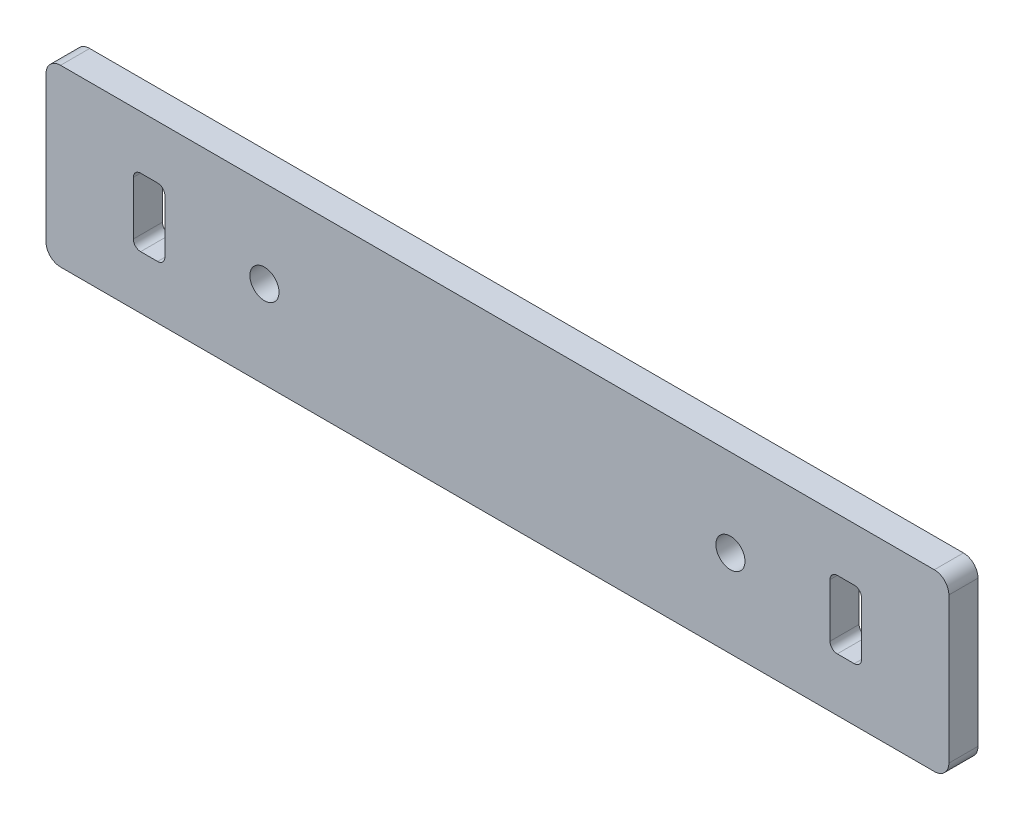
ISO-10303-21;
HEADER;
FILE_DESCRIPTION(('STEP AP214'),'2;1');
FILE_NAME('part.step','',(''),(''),'','','');
FILE_SCHEMA(('AUTOMOTIVE_DESIGN { 1 0 10303 214 1 1 1 1 }'));
ENDSEC;
DATA;
#1=APPLICATION_CONTEXT('core data for automotive mechanical design processes');
#2=APPLICATION_PROTOCOL_DEFINITION('international standard','automotive_design',2000,#1);
#3=PRODUCT_CONTEXT('',#1,'mechanical');
#4=PRODUCT('Part','Part','',(#3));
#5=PRODUCT_RELATED_PRODUCT_CATEGORY('part','',(#4));
#6=PRODUCT_DEFINITION_FORMATION('','',#4);
#7=PRODUCT_DEFINITION_CONTEXT('part definition',#1,'design');
#8=PRODUCT_DEFINITION('design','',#6,#7);
#9=PRODUCT_DEFINITION_SHAPE('','',#8);
#10=(LENGTH_UNIT() NAMED_UNIT(*) SI_UNIT(.MILLI.,.METRE.));
#11=(NAMED_UNIT(*) PLANE_ANGLE_UNIT() SI_UNIT($,.RADIAN.));
#12=(NAMED_UNIT(*) SI_UNIT($,.STERADIAN.) SOLID_ANGLE_UNIT());
#13=UNCERTAINTY_MEASURE_WITH_UNIT(LENGTH_MEASURE(1.E-05),#10,'distance_accuracy_value','');
#14=(GEOMETRIC_REPRESENTATION_CONTEXT(3) GLOBAL_UNCERTAINTY_ASSIGNED_CONTEXT((#13)) GLOBAL_UNIT_ASSIGNED_CONTEXT((#10,
#11,#12)) REPRESENTATION_CONTEXT('',''));
#15=CARTESIAN_POINT('',(0.,0.,0.));
#16=DIRECTION('',(0.,0.,1.));
#17=DIRECTION('',(1.,0.,0.));
#18=AXIS2_PLACEMENT_3D('',#15,#16,#17);
#19=CARTESIAN_POINT('',(-1478.2269349458,335.4081797565,3.));
#20=DIRECTION('',(0.,0.,1.));
#21=DIRECTION('',(1.,0.,0.));
#22=AXIS2_PLACEMENT_3D('',#19,#20,#21);
#23=PLANE('',#22);
#24=DIRECTION('',(0.,-1.,0.));
#25=VECTOR('',#24,1.);
#26=CARTESIAN_POINT('',(-1470.7319349458,325.1581797565,3.));
#27=LINE('',#26,#25);
#28=CARTESIAN_POINT('',(-1470.7319349458,330.6581797565,3.));
#29=VERTEX_POINT('',#28);
#30=CARTESIAN_POINT('',(-1470.7319349458,325.1581797565,3.));
#31=VERTEX_POINT('',#30);
#32=EDGE_CURVE('E261',#29,#31,#27,.T.);
#33=ORIENTED_EDGE('',*,*,#32,.F.);
#34=CARTESIAN_POINT('',(-1469.9819349458,330.6581797565,3.));
#35=DIRECTION('',(0.,0.,1.));
#36=DIRECTION('',(1.,0.,0.));
#37=AXIS2_PLACEMENT_3D('',#34,#35,#36);
#38=CIRCLE('',#37,0.750000000000028);
#39=CARTESIAN_POINT('',(-1469.9819349458,331.4081797565,3.));
#40=VERTEX_POINT('',#39);
#41=EDGE_CURVE('E259',#40,#29,#38,.T.);
#42=ORIENTED_EDGE('',*,*,#41,.F.);
#43=DIRECTION('',(-1.,0.,0.));
#44=VECTOR('',#43,1.);
#45=CARTESIAN_POINT('',(-1469.9819349458,331.4081797565,3.));
#46=LINE('',#45,#44);
#47=CARTESIAN_POINT('',(-1468.2319349458,331.4081797565,3.));
#48=VERTEX_POINT('',#47);
#49=EDGE_CURVE('E275',#48,#40,#46,.T.);
#50=ORIENTED_EDGE('',*,*,#49,.F.);
#51=CARTESIAN_POINT('',(-1468.2319349458,330.6581797565,3.));
#52=DIRECTION('',(0.,0.,1.));
#53=DIRECTION('',(1.,0.,0.));
#54=AXIS2_PLACEMENT_3D('',#51,#52,#53);
#55=CIRCLE('',#54,0.750000000000028);
#56=CARTESIAN_POINT('',(-1467.4819349458,330.6581797565,3.));
#57=VERTEX_POINT('',#56);
#58=EDGE_CURVE('E272',#57,#48,#55,.T.);
#59=ORIENTED_EDGE('',*,*,#58,.F.);
#60=DIRECTION('',(0.,1.,0.));
#61=VECTOR('',#60,1.);
#62=CARTESIAN_POINT('',(-1467.4819349458,325.1581797565,3.));
#63=LINE('',#62,#61);
#64=CARTESIAN_POINT('',(-1467.4819349458,325.1581797565,3.));
#65=VERTEX_POINT('',#64);
#66=EDGE_CURVE('E270',#65,#57,#63,.T.);
#67=ORIENTED_EDGE('',*,*,#66,.F.);
#68=CARTESIAN_POINT('',(-1468.2319349458,325.1581797565,3.));
#69=DIRECTION('',(0.,0.,1.));
#70=DIRECTION('',(1.,0.,0.));
#71=AXIS2_PLACEMENT_3D('',#68,#69,#70);
#72=CIRCLE('',#71,0.750000000000001);
#73=CARTESIAN_POINT('',(-1468.2319349458,324.4081797565,3.));
#74=VERTEX_POINT('',#73);
#75=EDGE_CURVE('E268',#74,#65,#72,.T.);
#76=ORIENTED_EDGE('',*,*,#75,.F.);
#77=DIRECTION('',(1.,0.,0.));
#78=VECTOR('',#77,1.);
#79=CARTESIAN_POINT('',(-1468.2319349458,324.4081797565,3.));
#80=LINE('',#79,#78);
#81=CARTESIAN_POINT('',(-1469.9819349458,324.4081797565,3.));
#82=VERTEX_POINT('',#81);
#83=EDGE_CURVE('E266',#82,#74,#80,.T.);
#84=ORIENTED_EDGE('',*,*,#83,.F.);
#85=CARTESIAN_POINT('',(-1469.9819349458,325.1581797565,3.));
#86=DIRECTION('',(0.,0.,1.));
#87=DIRECTION('',(1.,0.,0.));
#88=AXIS2_PLACEMENT_3D('',#85,#86,#87);
#89=CIRCLE('',#88,0.750000000000001);
#90=EDGE_CURVE('E264',#31,#82,#89,.T.);
#91=ORIENTED_EDGE('',*,*,#90,.F.);
#92=EDGE_LOOP('',(#33,#42,#50,#59,#67,#76,#84,#91));
#93=FACE_BOUND('',#92,.T.);
#94=CARTESIAN_POINT('',(-1457.2269349458,327.9081797565,3.));
#95=DIRECTION('',(0.,0.,1.));
#96=DIRECTION('',(1.,0.,0.));
#97=AXIS2_PLACEMENT_3D('',#94,#95,#96);
#98=CIRCLE('',#97,1.50000000000006);
#99=CARTESIAN_POINT('',(-1455.7269349458,327.9081797565,3.));
#100=VERTEX_POINT('',#99);
#101=EDGE_CURVE('E324',#100,#100,#98,.T.);
#102=ORIENTED_EDGE('',*,*,#101,.F.);
#103=EDGE_LOOP('',(#102));
#104=FACE_BOUND('',#103,.T.);
#105=CARTESIAN_POINT('',(-1478.2269349458,335.4081797565,3.));
#106=DIRECTION('',(0.,0.,1.));
#107=DIRECTION('',(1.,0.,0.));
#108=AXIS2_PLACEMENT_3D('',#105,#106,#107);
#109=CIRCLE('',#108,1.50000000000003);
#110=CARTESIAN_POINT('',(-1478.2269349458,336.9081797565,3.));
#111=VERTEX_POINT('',#110);
#112=CARTESIAN_POINT('',(-1479.7269349458,335.4081797565,3.));
#113=VERTEX_POINT('',#112);
#114=EDGE_CURVE('E330',#111,#113,#109,.T.);
#115=ORIENTED_EDGE('',*,*,#114,.T.);
#116=DIRECTION('',(0.,-1.,0.));
#117=VECTOR('',#116,1.);
#118=CARTESIAN_POINT('',(-1479.7269349458,320.4081797565,3.));
#119=LINE('',#118,#117);
#120=CARTESIAN_POINT('',(-1479.7269349458,320.4081797565,3.));
#121=VERTEX_POINT('',#120);
#122=EDGE_CURVE('E333',#113,#121,#119,.T.);
#123=ORIENTED_EDGE('',*,*,#122,.T.);
#124=CARTESIAN_POINT('',(-1478.2269349458,320.4081797565,3.));
#125=DIRECTION('',(0.,0.,1.));
#126=DIRECTION('',(1.,0.,0.));
#127=AXIS2_PLACEMENT_3D('',#124,#125,#126);
#128=CIRCLE('',#127,1.50000000000003);
#129=CARTESIAN_POINT('',(-1478.2269349458,318.9081797565,3.));
#130=VERTEX_POINT('',#129);
#131=EDGE_CURVE('E336',#121,#130,#128,.T.);
#132=ORIENTED_EDGE('',*,*,#131,.T.);
#133=DIRECTION('',(1.,0.,0.));
#134=VECTOR('',#133,1.);
#135=CARTESIAN_POINT('',(-1478.2269349458,318.9081797565,3.));
#136=LINE('',#135,#134);
#137=CARTESIAN_POINT('',(-1388.2269349458,318.9081797565,3.));
#138=VERTEX_POINT('',#137);
#139=EDGE_CURVE('E338',#130,#138,#136,.T.);
#140=ORIENTED_EDGE('',*,*,#139,.T.);
#141=CARTESIAN_POINT('',(-1388.2269349458,320.4081797565,3.));
#142=DIRECTION('',(0.,0.,1.));
#143=DIRECTION('',(1.,0.,0.));
#144=AXIS2_PLACEMENT_3D('',#141,#142,#143);
#145=CIRCLE('',#144,1.50000000000003);
#146=CARTESIAN_POINT('',(-1386.7269349458,320.4081797565,3.));
#147=VERTEX_POINT('',#146);
#148=EDGE_CURVE('E340',#138,#147,#145,.T.);
#149=ORIENTED_EDGE('',*,*,#148,.T.);
#150=DIRECTION('',(0.,1.,0.));
#151=VECTOR('',#150,1.);
#152=CARTESIAN_POINT('',(-1386.7269349458,320.4081797565,3.));
#153=LINE('',#152,#151);
#154=CARTESIAN_POINT('',(-1386.7269349458,335.4081797565,3.));
#155=VERTEX_POINT('',#154);
#156=EDGE_CURVE('E342',#147,#155,#153,.T.);
#157=ORIENTED_EDGE('',*,*,#156,.T.);
#158=CARTESIAN_POINT('',(-1388.2269349458,335.4081797565,3.));
#159=DIRECTION('',(0.,0.,1.));
#160=DIRECTION('',(1.,0.,0.));
#161=AXIS2_PLACEMENT_3D('',#158,#159,#160);
#162=CIRCLE('',#161,1.50000000000003);
#163=CARTESIAN_POINT('',(-1388.2269349458,336.9081797565,3.));
#164=VERTEX_POINT('',#163);
#165=EDGE_CURVE('E344',#155,#164,#162,.T.);
#166=ORIENTED_EDGE('',*,*,#165,.T.);
#167=DIRECTION('',(-1.,0.,0.));
#168=VECTOR('',#167,1.);
#169=CARTESIAN_POINT('',(-1478.2269349458,336.9081797565,3.));
#170=LINE('',#169,#168);
#171=EDGE_CURVE('E346',#164,#111,#170,.T.);
#172=ORIENTED_EDGE('',*,*,#171,.T.);
#173=EDGE_LOOP('',(#115,#123,#132,#140,#149,#157,#166,#172));
#174=FACE_BOUND('',#173,.T.);
#175=CARTESIAN_POINT('',(-1409.2269349458,327.9081797565,3.));
#176=DIRECTION('',(0.,0.,1.));
#177=DIRECTION('',(1.,0.,0.));
#178=AXIS2_PLACEMENT_3D('',#175,#176,#177);
#179=CIRCLE('',#178,1.50000000000006);
#180=CARTESIAN_POINT('',(-1407.7269349458,327.9081797565,3.));
#181=VERTEX_POINT('',#180);
#182=EDGE_CURVE('E318',#181,#181,#179,.T.);
#183=ORIENTED_EDGE('',*,*,#182,.F.);
#184=EDGE_LOOP('',(#183));
#185=FACE_BOUND('',#184,.T.);
#186=DIRECTION('',(0.,-1.,0.));
#187=VECTOR('',#186,1.);
#188=CARTESIAN_POINT('',(-1398.9719349458,325.1581797565,3.));
#189=LINE('',#188,#187);
#190=CARTESIAN_POINT('',(-1398.9719349458,330.6581797565,3.));
#191=VERTEX_POINT('',#190);
#192=CARTESIAN_POINT('',(-1398.9719349458,325.1581797565,3.));
#193=VERTEX_POINT('',#192);
#194=EDGE_CURVE('E202',#191,#193,#189,.T.);
#195=ORIENTED_EDGE('',*,*,#194,.F.);
#196=CARTESIAN_POINT('',(-1398.2219349458,330.6581797565,3.));
#197=DIRECTION('',(0.,0.,1.));
#198=DIRECTION('',(1.,0.,0.));
#199=AXIS2_PLACEMENT_3D('',#196,#197,#198);
#200=CIRCLE('',#199,0.750000000000028);
#201=CARTESIAN_POINT('',(-1398.2219349458,331.4081797565,3.));
#202=VERTEX_POINT('',#201);
#203=EDGE_CURVE('E194',#202,#191,#200,.T.);
#204=ORIENTED_EDGE('',*,*,#203,.F.);
#205=DIRECTION('',(-1.,0.,0.));
#206=VECTOR('',#205,1.);
#207=CARTESIAN_POINT('',(-1398.2219349458,331.4081797565,3.));
#208=LINE('',#207,#206);
#209=CARTESIAN_POINT('',(-1396.4719349458,331.4081797565,3.));
#210=VERTEX_POINT('',#209);
#211=EDGE_CURVE('E227',#210,#202,#208,.T.);
#212=ORIENTED_EDGE('',*,*,#211,.F.);
#213=CARTESIAN_POINT('',(-1396.4719349458,330.6581797565,3.));
#214=DIRECTION('',(0.,0.,1.));
#215=DIRECTION('',(1.,0.,0.));
#216=AXIS2_PLACEMENT_3D('',#213,#214,#215);
#217=CIRCLE('',#216,0.750000000000028);
#218=CARTESIAN_POINT('',(-1395.7219349458,330.6581797565,3.));
#219=VERTEX_POINT('',#218);
#220=EDGE_CURVE('E225',#219,#210,#217,.T.);
#221=ORIENTED_EDGE('',*,*,#220,.F.);
#222=DIRECTION('',(0.,1.,0.));
#223=VECTOR('',#222,1.);
#224=CARTESIAN_POINT('',(-1395.7219349458,325.1581797565,3.));
#225=LINE('',#224,#223);
#226=CARTESIAN_POINT('',(-1395.7219349458,325.1581797565,3.));
#227=VERTEX_POINT('',#226);
#228=EDGE_CURVE('E223',#227,#219,#225,.T.);
#229=ORIENTED_EDGE('',*,*,#228,.F.);
#230=CARTESIAN_POINT('',(-1396.4719349458,325.1581797565,3.));
#231=DIRECTION('',(0.,0.,1.));
#232=DIRECTION('',(1.,0.,0.));
#233=AXIS2_PLACEMENT_3D('',#230,#231,#232);
#234=CIRCLE('',#233,0.750000000000001);
#235=CARTESIAN_POINT('',(-1396.4719349458,324.4081797565,3.));
#236=VERTEX_POINT('',#235);
#237=EDGE_CURVE('E221',#236,#227,#234,.T.);
#238=ORIENTED_EDGE('',*,*,#237,.F.);
#239=DIRECTION('',(1.,0.,0.));
#240=VECTOR('',#239,1.);
#241=CARTESIAN_POINT('',(-1396.4719349458,324.4081797565,3.));
#242=LINE('',#241,#240);
#243=CARTESIAN_POINT('',(-1398.2219349458,324.4081797565,3.));
#244=VERTEX_POINT('',#243);
#245=EDGE_CURVE('E217',#244,#236,#242,.T.);
#246=ORIENTED_EDGE('',*,*,#245,.F.);
#247=CARTESIAN_POINT('',(-1398.2219349458,325.1581797565,3.));
#248=DIRECTION('',(0.,0.,1.));
#249=DIRECTION('',(1.,0.,0.));
#250=AXIS2_PLACEMENT_3D('',#247,#248,#249);
#251=CIRCLE('',#250,0.750000000000001);
#252=EDGE_CURVE('E215',#193,#244,#251,.T.);
#253=ORIENTED_EDGE('',*,*,#252,.F.);
#254=EDGE_LOOP('',(#195,#204,#212,#221,#229,#238,#246,#253));
#255=FACE_BOUND('',#254,.T.);
#256=ADVANCED_FACE('F33',(#93,#104,#174,#185,#255),#23,.T.);
#257=CARTESIAN_POINT('',(-1478.2269349458,335.4081797565,0.));
#258=DIRECTION('',(0.,0.,1.));
#259=DIRECTION('',(1.,0.,0.));
#260=AXIS2_PLACEMENT_3D('',#257,#258,#259);
#261=PLANE('',#260);
#262=CARTESIAN_POINT('',(-1469.9819349458,330.6581797565,0.));
#263=DIRECTION('',(0.,0.,1.));
#264=DIRECTION('',(1.,0.,0.));
#265=AXIS2_PLACEMENT_3D('',#262,#263,#264);
#266=CIRCLE('',#265,0.750000000000028);
#267=CARTESIAN_POINT('',(-1469.9819349458,331.4081797565,0.));
#268=VERTEX_POINT('',#267);
#269=CARTESIAN_POINT('',(-1470.7319349458,330.6581797565,0.));
#270=VERTEX_POINT('',#269);
#271=EDGE_CURVE('E210',#268,#270,#266,.T.);
#272=ORIENTED_EDGE('',*,*,#271,.T.);
#273=DIRECTION('',(0.,-1.,0.));
#274=VECTOR('',#273,1.);
#275=CARTESIAN_POINT('',(-1470.7319349458,325.1581797565,0.));
#276=LINE('',#275,#274);
#277=CARTESIAN_POINT('',(-1470.7319349458,325.1581797565,0.));
#278=VERTEX_POINT('',#277);
#279=EDGE_CURVE('E280',#270,#278,#276,.T.);
#280=ORIENTED_EDGE('',*,*,#279,.T.);
#281=CARTESIAN_POINT('',(-1469.9819349458,325.1581797565,0.));
#282=DIRECTION('',(0.,0.,1.));
#283=DIRECTION('',(1.,0.,0.));
#284=AXIS2_PLACEMENT_3D('',#281,#282,#283);
#285=CIRCLE('',#284,0.750000000000001);
#286=CARTESIAN_POINT('',(-1469.9819349458,324.4081797565,0.));
#287=VERTEX_POINT('',#286);
#288=EDGE_CURVE('E283',#278,#287,#285,.T.);
#289=ORIENTED_EDGE('',*,*,#288,.T.);
#290=DIRECTION('',(1.,0.,0.));
#291=VECTOR('',#290,1.);
#292=CARTESIAN_POINT('',(-1468.2319349458,324.4081797565,0.));
#293=LINE('',#292,#291);
#294=CARTESIAN_POINT('',(-1468.2319349458,324.4081797565,0.));
#295=VERTEX_POINT('',#294);
#296=EDGE_CURVE('E286',#287,#295,#293,.T.);
#297=ORIENTED_EDGE('',*,*,#296,.T.);
#298=CARTESIAN_POINT('',(-1468.2319349458,325.1581797565,0.));
#299=DIRECTION('',(0.,0.,1.));
#300=DIRECTION('',(1.,0.,0.));
#301=AXIS2_PLACEMENT_3D('',#298,#299,#300);
#302=CIRCLE('',#301,0.750000000000001);
#303=CARTESIAN_POINT('',(-1467.4819349458,325.1581797565,0.));
#304=VERTEX_POINT('',#303);
#305=EDGE_CURVE('E289',#295,#304,#302,.T.);
#306=ORIENTED_EDGE('',*,*,#305,.T.);
#307=DIRECTION('',(0.,1.,0.));
#308=VECTOR('',#307,1.);
#309=CARTESIAN_POINT('',(-1467.4819349458,325.1581797565,0.));
#310=LINE('',#309,#308);
#311=CARTESIAN_POINT('',(-1467.4819349458,330.6581797565,0.));
#312=VERTEX_POINT('',#311);
#313=EDGE_CURVE('E292',#304,#312,#310,.T.);
#314=ORIENTED_EDGE('',*,*,#313,.T.);
#315=CARTESIAN_POINT('',(-1468.2319349458,330.6581797565,0.));
#316=DIRECTION('',(0.,0.,1.));
#317=DIRECTION('',(1.,0.,0.));
#318=AXIS2_PLACEMENT_3D('',#315,#316,#317);
#319=CIRCLE('',#318,0.750000000000028);
#320=CARTESIAN_POINT('',(-1468.2319349458,331.4081797565,0.));
#321=VERTEX_POINT('',#320);
#322=EDGE_CURVE('E295',#312,#321,#319,.T.);
#323=ORIENTED_EDGE('',*,*,#322,.T.);
#324=DIRECTION('',(-1.,0.,0.));
#325=VECTOR('',#324,1.);
#326=CARTESIAN_POINT('',(-1469.9819349458,331.4081797565,0.));
#327=LINE('',#326,#325);
#328=EDGE_CURVE('E262',#321,#268,#327,.T.);
#329=ORIENTED_EDGE('',*,*,#328,.T.);
#330=EDGE_LOOP('',(#272,#280,#289,#297,#306,#314,#323,#329));
#331=FACE_BOUND('',#330,.T.);
#332=CARTESIAN_POINT('',(-1457.2269349458,327.9081797565,0.));
#333=DIRECTION('',(0.,0.,1.));
#334=DIRECTION('',(1.,0.,0.));
#335=AXIS2_PLACEMENT_3D('',#332,#333,#334);
#336=CIRCLE('',#335,1.50000000000006);
#337=CARTESIAN_POINT('',(-1455.7269349458,327.9081797565,0.));
#338=VERTEX_POINT('',#337);
#339=EDGE_CURVE('E321',#338,#338,#336,.T.);
#340=ORIENTED_EDGE('',*,*,#339,.T.);
#341=EDGE_LOOP('',(#340));
#342=FACE_BOUND('',#341,.T.);
#343=CARTESIAN_POINT('',(-1478.2269349458,335.4081797565,0.));
#344=DIRECTION('',(0.,0.,1.));
#345=DIRECTION('',(1.,0.,0.));
#346=AXIS2_PLACEMENT_3D('',#343,#344,#345);
#347=CIRCLE('',#346,1.50000000000003);
#348=CARTESIAN_POINT('',(-1478.2269349458,336.9081797565,0.));
#349=VERTEX_POINT('',#348);
#350=CARTESIAN_POINT('',(-1479.7269349458,335.4081797565,0.));
#351=VERTEX_POINT('',#350);
#352=EDGE_CURVE('E327',#349,#351,#347,.T.);
#353=ORIENTED_EDGE('',*,*,#352,.F.);
#354=DIRECTION('',(-1.,0.,0.));
#355=VECTOR('',#354,1.);
#356=CARTESIAN_POINT('',(-1478.2269349458,336.9081797565,0.));
#357=LINE('',#356,#355);
#358=CARTESIAN_POINT('',(-1388.2269349458,336.9081797565,0.));
#359=VERTEX_POINT('',#358);
#360=EDGE_CURVE('E334',#359,#349,#357,.T.);
#361=ORIENTED_EDGE('',*,*,#360,.F.);
#362=CARTESIAN_POINT('',(-1388.2269349458,335.4081797565,0.));
#363=DIRECTION('',(0.,0.,1.));
#364=DIRECTION('',(1.,0.,0.));
#365=AXIS2_PLACEMENT_3D('',#362,#363,#364);
#366=CIRCLE('',#365,1.50000000000003);
#367=CARTESIAN_POINT('',(-1386.7269349458,335.4081797565,0.));
#368=VERTEX_POINT('',#367);
#369=EDGE_CURVE('E361',#368,#359,#366,.T.);
#370=ORIENTED_EDGE('',*,*,#369,.F.);
#371=DIRECTION('',(0.,1.,0.));
#372=VECTOR('',#371,1.);
#373=CARTESIAN_POINT('',(-1386.7269349458,320.4081797565,0.));
#374=LINE('',#373,#372);
#375=CARTESIAN_POINT('',(-1386.7269349458,320.4081797565,0.));
#376=VERTEX_POINT('',#375);
#377=EDGE_CURVE('E359',#376,#368,#374,.T.);
#378=ORIENTED_EDGE('',*,*,#377,.F.);
#379=CARTESIAN_POINT('',(-1388.2269349458,320.4081797565,0.));
#380=DIRECTION('',(0.,0.,1.));
#381=DIRECTION('',(1.,0.,0.));
#382=AXIS2_PLACEMENT_3D('',#379,#380,#381);
#383=CIRCLE('',#382,1.50000000000003);
#384=CARTESIAN_POINT('',(-1388.2269349458,318.9081797565,0.));
#385=VERTEX_POINT('',#384);
#386=EDGE_CURVE('E357',#385,#376,#383,.T.);
#387=ORIENTED_EDGE('',*,*,#386,.F.);
#388=DIRECTION('',(1.,0.,0.));
#389=VECTOR('',#388,1.);
#390=CARTESIAN_POINT('',(-1478.2269349458,318.9081797565,0.));
#391=LINE('',#390,#389);
#392=CARTESIAN_POINT('',(-1478.2269349458,318.9081797565,0.));
#393=VERTEX_POINT('',#392);
#394=EDGE_CURVE('E355',#393,#385,#391,.T.);
#395=ORIENTED_EDGE('',*,*,#394,.F.);
#396=CARTESIAN_POINT('',(-1478.2269349458,320.4081797565,0.));
#397=DIRECTION('',(0.,0.,1.));
#398=DIRECTION('',(1.,0.,0.));
#399=AXIS2_PLACEMENT_3D('',#396,#397,#398);
#400=CIRCLE('',#399,1.50000000000003);
#401=CARTESIAN_POINT('',(-1479.7269349458,320.4081797565,0.));
#402=VERTEX_POINT('',#401);
#403=EDGE_CURVE('E353',#402,#393,#400,.T.);
#404=ORIENTED_EDGE('',*,*,#403,.F.);
#405=DIRECTION('',(0.,-1.,0.));
#406=VECTOR('',#405,1.);
#407=CARTESIAN_POINT('',(-1479.7269349458,320.4081797565,0.));
#408=LINE('',#407,#406);
#409=EDGE_CURVE('E351',#351,#402,#408,.T.);
#410=ORIENTED_EDGE('',*,*,#409,.F.);
#411=EDGE_LOOP('',(#353,#361,#370,#378,#387,#395,#404,#410));
#412=FACE_BOUND('',#411,.T.);
#413=CARTESIAN_POINT('',(-1409.2269349458,327.9081797565,0.));
#414=DIRECTION('',(0.,0.,1.));
#415=DIRECTION('',(1.,0.,0.));
#416=AXIS2_PLACEMENT_3D('',#413,#414,#415);
#417=CIRCLE('',#416,1.50000000000006);
#418=CARTESIAN_POINT('',(-1407.7269349458,327.9081797565,0.));
#419=VERTEX_POINT('',#418);
#420=EDGE_CURVE('E317',#419,#419,#417,.T.);
#421=ORIENTED_EDGE('',*,*,#420,.T.);
#422=EDGE_LOOP('',(#421));
#423=FACE_BOUND('',#422,.T.);
#424=CARTESIAN_POINT('',(-1398.2219349458,330.6581797565,0.));
#425=DIRECTION('',(0.,0.,1.));
#426=DIRECTION('',(1.,0.,0.));
#427=AXIS2_PLACEMENT_3D('',#424,#425,#426);
#428=CIRCLE('',#427,0.750000000000028);
#429=CARTESIAN_POINT('',(-1398.2219349458,331.4081797565,0.));
#430=VERTEX_POINT('',#429);
#431=CARTESIAN_POINT('',(-1398.9719349458,330.6581797565,0.));
#432=VERTEX_POINT('',#431);
#433=EDGE_CURVE('E56',#430,#432,#428,.T.);
#434=ORIENTED_EDGE('',*,*,#433,.T.);
#435=DIRECTION('',(0.,-1.,0.));
#436=VECTOR('',#435,1.);
#437=CARTESIAN_POINT('',(-1398.9719349458,325.1581797565,0.));
#438=LINE('',#437,#436);
#439=CARTESIAN_POINT('',(-1398.9719349458,325.1581797565,0.));
#440=VERTEX_POINT('',#439);
#441=EDGE_CURVE('E209',#432,#440,#438,.T.);
#442=ORIENTED_EDGE('',*,*,#441,.T.);
#443=CARTESIAN_POINT('',(-1398.2219349458,325.1581797565,0.));
#444=DIRECTION('',(0.,0.,1.));
#445=DIRECTION('',(1.,0.,0.));
#446=AXIS2_PLACEMENT_3D('',#443,#444,#445);
#447=CIRCLE('',#446,0.750000000000001);
#448=CARTESIAN_POINT('',(-1398.2219349458,324.4081797565,0.));
#449=VERTEX_POINT('',#448);
#450=EDGE_CURVE('E231',#440,#449,#447,.T.);
#451=ORIENTED_EDGE('',*,*,#450,.T.);
#452=DIRECTION('',(1.,0.,0.));
#453=VECTOR('',#452,1.);
#454=CARTESIAN_POINT('',(-1396.4719349458,324.4081797565,0.));
#455=LINE('',#454,#453);
#456=CARTESIAN_POINT('',(-1396.4719349458,324.4081797565,0.));
#457=VERTEX_POINT('',#456);
#458=EDGE_CURVE('E234',#449,#457,#455,.T.);
#459=ORIENTED_EDGE('',*,*,#458,.T.);
#460=CARTESIAN_POINT('',(-1396.4719349458,325.1581797565,0.));
#461=DIRECTION('',(0.,0.,1.));
#462=DIRECTION('',(1.,0.,0.));
#463=AXIS2_PLACEMENT_3D('',#460,#461,#462);
#464=CIRCLE('',#463,0.750000000000001);
#465=CARTESIAN_POINT('',(-1395.7219349458,325.1581797565,0.));
#466=VERTEX_POINT('',#465);
#467=EDGE_CURVE('E237',#457,#466,#464,.T.);
#468=ORIENTED_EDGE('',*,*,#467,.T.);
#469=DIRECTION('',(0.,1.,0.));
#470=VECTOR('',#469,1.);
#471=CARTESIAN_POINT('',(-1395.7219349458,325.1581797565,0.));
#472=LINE('',#471,#470);
#473=CARTESIAN_POINT('',(-1395.7219349458,330.6581797565,0.));
#474=VERTEX_POINT('',#473);
#475=EDGE_CURVE('E240',#466,#474,#472,.T.);
#476=ORIENTED_EDGE('',*,*,#475,.T.);
#477=CARTESIAN_POINT('',(-1396.4719349458,330.6581797565,0.));
#478=DIRECTION('',(0.,0.,1.));
#479=DIRECTION('',(1.,0.,0.));
#480=AXIS2_PLACEMENT_3D('',#477,#478,#479);
#481=CIRCLE('',#480,0.750000000000028);
#482=CARTESIAN_POINT('',(-1396.4719349458,331.4081797565,0.));
#483=VERTEX_POINT('',#482);
#484=EDGE_CURVE('E243',#474,#483,#481,.T.);
#485=ORIENTED_EDGE('',*,*,#484,.T.);
#486=DIRECTION('',(-1.,0.,0.));
#487=VECTOR('',#486,1.);
#488=CARTESIAN_POINT('',(-1398.2219349458,331.4081797565,0.));
#489=LINE('',#488,#487);
#490=EDGE_CURVE('E203',#483,#430,#489,.T.);
#491=ORIENTED_EDGE('',*,*,#490,.T.);
#492=EDGE_LOOP('',(#434,#442,#451,#459,#468,#476,#485,#491));
#493=FACE_BOUND('',#492,.T.);
#494=ADVANCED_FACE('F391',(#331,#342,#412,#423,#493),#261,.F.);
#495=CARTESIAN_POINT('',(-1478.2269349458,335.4081797565,3.));
#496=DIRECTION('',(0.,0.,-1.));
#497=DIRECTION('',(-1.,0.,0.));
#498=AXIS2_PLACEMENT_3D('',#495,#496,#497);
#499=CYLINDRICAL_SURFACE('',#498,1.50000000000003);
#500=ORIENTED_EDGE('',*,*,#352,.T.);
#501=DIRECTION('',(0.,0.,-1.));
#502=VECTOR('',#501,1.);
#503=CARTESIAN_POINT('',(-1479.7269349458,335.4081797565,3.));
#504=LINE('',#503,#502);
#505=EDGE_CURVE('E11',#113,#351,#504,.T.);
#506=ORIENTED_EDGE('',*,*,#505,.F.);
#507=ORIENTED_EDGE('',*,*,#114,.F.);
#508=DIRECTION('',(0.,0.,-1.));
#509=VECTOR('',#508,1.);
#510=CARTESIAN_POINT('',(-1478.2269349458,336.9081797565,3.));
#511=LINE('',#510,#509);
#512=EDGE_CURVE('E348',#111,#349,#511,.T.);
#513=ORIENTED_EDGE('',*,*,#512,.T.);
#514=EDGE_LOOP('',(#500,#506,#507,#513));
#515=FACE_BOUND('',#514,.T.);
#516=ADVANCED_FACE('F35',(#515),#499,.T.);
#517=CARTESIAN_POINT('',(-1479.7269349458,320.4081797565,3.));
#518=DIRECTION('',(1.,0.,0.));
#519=DIRECTION('',(0.,0.,-1.));
#520=AXIS2_PLACEMENT_3D('',#517,#518,#519);
#521=PLANE('',#520);
#522=ORIENTED_EDGE('',*,*,#409,.T.);
#523=DIRECTION('',(0.,0.,-1.));
#524=VECTOR('',#523,1.);
#525=CARTESIAN_POINT('',(-1479.7269349458,320.4081797565,3.));
#526=LINE('',#525,#524);
#527=EDGE_CURVE('E41',#121,#402,#526,.T.);
#528=ORIENTED_EDGE('',*,*,#527,.F.);
#529=ORIENTED_EDGE('',*,*,#122,.F.);
#530=ORIENTED_EDGE('',*,*,#505,.T.);
#531=EDGE_LOOP('',(#522,#528,#529,#530));
#532=FACE_BOUND('',#531,.T.);
#533=ADVANCED_FACE('F409',(#532),#521,.F.);
#534=CARTESIAN_POINT('',(-1478.2269349458,320.4081797565,3.));
#535=DIRECTION('',(0.,0.,-1.));
#536=DIRECTION('',(-1.,0.,0.));
#537=AXIS2_PLACEMENT_3D('',#534,#535,#536);
#538=CYLINDRICAL_SURFACE('',#537,1.50000000000003);
#539=ORIENTED_EDGE('',*,*,#403,.T.);
#540=DIRECTION('',(0.,0.,-1.));
#541=VECTOR('',#540,1.);
#542=CARTESIAN_POINT('',(-1478.2269349458,318.9081797565,3.));
#543=LINE('',#542,#541);
#544=EDGE_CURVE('E378',#130,#393,#543,.T.);
#545=ORIENTED_EDGE('',*,*,#544,.F.);
#546=ORIENTED_EDGE('',*,*,#131,.F.);
#547=ORIENTED_EDGE('',*,*,#527,.T.);
#548=EDGE_LOOP('',(#539,#545,#546,#547));
#549=FACE_BOUND('',#548,.T.);
#550=ADVANCED_FACE('F385',(#549),#538,.T.);
#551=CARTESIAN_POINT('',(-1478.2269349458,318.9081797565,3.));
#552=DIRECTION('',(0.,1.,0.));
#553=DIRECTION('',(0.,0.,1.));
#554=AXIS2_PLACEMENT_3D('',#551,#552,#553);
#555=PLANE('',#554);
#556=ORIENTED_EDGE('',*,*,#394,.T.);
#557=DIRECTION('',(0.,0.,-1.));
#558=VECTOR('',#557,1.);
#559=CARTESIAN_POINT('',(-1388.2269349458,318.9081797565,3.));
#560=LINE('',#559,#558);
#561=EDGE_CURVE('E375',#138,#385,#560,.T.);
#562=ORIENTED_EDGE('',*,*,#561,.F.);
#563=ORIENTED_EDGE('',*,*,#139,.F.);
#564=ORIENTED_EDGE('',*,*,#544,.T.);
#565=EDGE_LOOP('',(#556,#562,#563,#564));
#566=FACE_BOUND('',#565,.T.);
#567=ADVANCED_FACE('F397',(#566),#555,.F.);
#568=CARTESIAN_POINT('',(-1388.2269349458,320.4081797565,3.));
#569=DIRECTION('',(0.,0.,-1.));
#570=DIRECTION('',(-1.,0.,0.));
#571=AXIS2_PLACEMENT_3D('',#568,#569,#570);
#572=CYLINDRICAL_SURFACE('',#571,1.50000000000003);
#573=ORIENTED_EDGE('',*,*,#386,.T.);
#574=DIRECTION('',(0.,0.,-1.));
#575=VECTOR('',#574,1.);
#576=CARTESIAN_POINT('',(-1386.7269349458,320.4081797565,3.));
#577=LINE('',#576,#575);
#578=EDGE_CURVE('E372',#147,#376,#577,.T.);
#579=ORIENTED_EDGE('',*,*,#578,.F.);
#580=ORIENTED_EDGE('',*,*,#148,.F.);
#581=ORIENTED_EDGE('',*,*,#561,.T.);
#582=EDGE_LOOP('',(#573,#579,#580,#581));
#583=FACE_BOUND('',#582,.T.);
#584=ADVANCED_FACE('F401',(#583),#572,.T.);
#585=CARTESIAN_POINT('',(-1386.7269349458,320.4081797565,3.));
#586=DIRECTION('',(-1.,0.,0.));
#587=DIRECTION('',(0.,0.,1.));
#588=AXIS2_PLACEMENT_3D('',#585,#586,#587);
#589=PLANE('',#588);
#590=ORIENTED_EDGE('',*,*,#377,.T.);
#591=DIRECTION('',(0.,0.,-1.));
#592=VECTOR('',#591,1.);
#593=CARTESIAN_POINT('',(-1386.7269349458,335.4081797565,3.));
#594=LINE('',#593,#592);
#595=EDGE_CURVE('E369',#155,#368,#594,.T.);
#596=ORIENTED_EDGE('',*,*,#595,.F.);
#597=ORIENTED_EDGE('',*,*,#156,.F.);
#598=ORIENTED_EDGE('',*,*,#578,.T.);
#599=EDGE_LOOP('',(#590,#596,#597,#598));
#600=FACE_BOUND('',#599,.T.);
#601=ADVANCED_FACE('F422',(#600),#589,.F.);
#602=CARTESIAN_POINT('',(-1388.2269349458,335.4081797565,3.));
#603=DIRECTION('',(0.,0.,-1.));
#604=DIRECTION('',(-1.,0.,0.));
#605=AXIS2_PLACEMENT_3D('',#602,#603,#604);
#606=CYLINDRICAL_SURFACE('',#605,1.50000000000003);
#607=ORIENTED_EDGE('',*,*,#369,.T.);
#608=DIRECTION('',(0.,0.,-1.));
#609=VECTOR('',#608,1.);
#610=CARTESIAN_POINT('',(-1388.2269349458,336.9081797565,3.));
#611=LINE('',#610,#609);
#612=EDGE_CURVE('E366',#164,#359,#611,.T.);
#613=ORIENTED_EDGE('',*,*,#612,.F.);
#614=ORIENTED_EDGE('',*,*,#165,.F.);
#615=ORIENTED_EDGE('',*,*,#595,.T.);
#616=EDGE_LOOP('',(#607,#613,#614,#615));
#617=FACE_BOUND('',#616,.T.);
#618=ADVANCED_FACE('F420',(#617),#606,.T.);
#619=CARTESIAN_POINT('',(-1478.2269349458,336.9081797565,3.));
#620=DIRECTION('',(0.,-1.,0.));
#621=DIRECTION('',(0.,0.,-1.));
#622=AXIS2_PLACEMENT_3D('',#619,#620,#621);
#623=PLANE('',#622);
#624=ORIENTED_EDGE('',*,*,#360,.T.);
#625=ORIENTED_EDGE('',*,*,#512,.F.);
#626=ORIENTED_EDGE('',*,*,#171,.F.);
#627=ORIENTED_EDGE('',*,*,#612,.T.);
#628=EDGE_LOOP('',(#624,#625,#626,#627));
#629=FACE_BOUND('',#628,.T.);
#630=ADVANCED_FACE('F415',(#629),#623,.F.);
#631=CARTESIAN_POINT('',(-1457.2269349458,327.9081797565,3.));
#632=DIRECTION('',(0.,0.,-1.));
#633=DIRECTION('',(-1.,0.,0.));
#634=AXIS2_PLACEMENT_3D('',#631,#632,#633);
#635=CYLINDRICAL_SURFACE('',#634,1.50000000000006);
#636=ORIENTED_EDGE('',*,*,#101,.T.);
#637=EDGE_LOOP('',(#636));
#638=FACE_BOUND('',#637,.T.);
#639=ORIENTED_EDGE('',*,*,#339,.F.);
#640=EDGE_LOOP('',(#639));
#641=FACE_BOUND('',#640,.T.);
#642=ADVANCED_FACE('F442',(#638,#641),#635,.F.);
#643=CARTESIAN_POINT('',(-1409.2269349458,327.9081797565,3.));
#644=DIRECTION('',(0.,0.,-1.));
#645=DIRECTION('',(-1.,0.,0.));
#646=AXIS2_PLACEMENT_3D('',#643,#644,#645);
#647=CYLINDRICAL_SURFACE('',#646,1.50000000000006);
#648=ORIENTED_EDGE('',*,*,#182,.T.);
#649=EDGE_LOOP('',(#648));
#650=FACE_BOUND('',#649,.T.);
#651=ORIENTED_EDGE('',*,*,#420,.F.);
#652=EDGE_LOOP('',(#651));
#653=FACE_BOUND('',#652,.T.);
#654=ADVANCED_FACE('F449',(#650,#653),#647,.F.);
#655=CARTESIAN_POINT('',(-1469.9819349458,330.6581797565,3.));
#656=DIRECTION('',(0.,0.,-1.));
#657=DIRECTION('',(-1.,0.,0.));
#658=AXIS2_PLACEMENT_3D('',#655,#656,#657);
#659=CYLINDRICAL_SURFACE('',#658,0.750000000000028);
#660=ORIENTED_EDGE('',*,*,#271,.F.);
#661=DIRECTION('',(0.,0.,-1.));
#662=VECTOR('',#661,1.);
#663=CARTESIAN_POINT('',(-1469.9819349458,331.4081797565,3.));
#664=LINE('',#663,#662);
#665=EDGE_CURVE('E277',#40,#268,#664,.T.);
#666=ORIENTED_EDGE('',*,*,#665,.F.);
#667=ORIENTED_EDGE('',*,*,#41,.T.);
#668=DIRECTION('',(0.,0.,-1.));
#669=VECTOR('',#668,1.);
#670=CARTESIAN_POINT('',(-1470.7319349458,330.6581797565,3.));
#671=LINE('',#670,#669);
#672=EDGE_CURVE('E314',#29,#270,#671,.T.);
#673=ORIENTED_EDGE('',*,*,#672,.T.);
#674=EDGE_LOOP('',(#660,#666,#667,#673));
#675=FACE_BOUND('',#674,.T.);
#676=ADVANCED_FACE('F454',(#675),#659,.F.);
#677=CARTESIAN_POINT('',(-1470.7319349458,325.1581797565,3.));
#678=DIRECTION('',(1.,0.,0.));
#679=DIRECTION('',(0.,0.,-1.));
#680=AXIS2_PLACEMENT_3D('',#677,#678,#679);
#681=PLANE('',#680);
#682=ORIENTED_EDGE('',*,*,#279,.F.);
#683=ORIENTED_EDGE('',*,*,#672,.F.);
#684=ORIENTED_EDGE('',*,*,#32,.T.);
#685=DIRECTION('',(0.,0.,-1.));
#686=VECTOR('',#685,1.);
#687=CARTESIAN_POINT('',(-1470.7319349458,325.1581797565,3.));
#688=LINE('',#687,#686);
#689=EDGE_CURVE('E312',#31,#278,#688,.T.);
#690=ORIENTED_EDGE('',*,*,#689,.T.);
#691=EDGE_LOOP('',(#682,#683,#684,#690));
#692=FACE_BOUND('',#691,.T.);
#693=ADVANCED_FACE('F463',(#692),#681,.T.);
#694=CARTESIAN_POINT('',(-1469.9819349458,325.1581797565,3.));
#695=DIRECTION('',(0.,0.,-1.));
#696=DIRECTION('',(-1.,0.,0.));
#697=AXIS2_PLACEMENT_3D('',#694,#695,#696);
#698=CYLINDRICAL_SURFACE('',#697,0.750000000000001);
#699=ORIENTED_EDGE('',*,*,#288,.F.);
#700=ORIENTED_EDGE('',*,*,#689,.F.);
#701=ORIENTED_EDGE('',*,*,#90,.T.);
#702=DIRECTION('',(0.,0.,-1.));
#703=VECTOR('',#702,1.);
#704=CARTESIAN_POINT('',(-1469.9819349458,324.4081797565,3.));
#705=LINE('',#704,#703);
#706=EDGE_CURVE('E310',#82,#287,#705,.T.);
#707=ORIENTED_EDGE('',*,*,#706,.T.);
#708=EDGE_LOOP('',(#699,#700,#701,#707));
#709=FACE_BOUND('',#708,.T.);
#710=ADVANCED_FACE('F470',(#709),#698,.F.);
#711=CARTESIAN_POINT('',(-1468.2319349458,324.4081797565,3.));
#712=DIRECTION('',(0.,1.,0.));
#713=DIRECTION('',(0.,0.,1.));
#714=AXIS2_PLACEMENT_3D('',#711,#712,#713);
#715=PLANE('',#714);
#716=ORIENTED_EDGE('',*,*,#296,.F.);
#717=ORIENTED_EDGE('',*,*,#706,.F.);
#718=ORIENTED_EDGE('',*,*,#83,.T.);
#719=DIRECTION('',(0.,0.,-1.));
#720=VECTOR('',#719,1.);
#721=CARTESIAN_POINT('',(-1468.2319349458,324.4081797565,3.));
#722=LINE('',#721,#720);
#723=EDGE_CURVE('E308',#74,#295,#722,.T.);
#724=ORIENTED_EDGE('',*,*,#723,.T.);
#725=EDGE_LOOP('',(#716,#717,#718,#724));
#726=FACE_BOUND('',#725,.T.);
#727=ADVANCED_FACE('F474',(#726),#715,.T.);
#728=CARTESIAN_POINT('',(-1468.2319349458,325.1581797565,3.));
#729=DIRECTION('',(0.,0.,-1.));
#730=DIRECTION('',(-1.,0.,0.));
#731=AXIS2_PLACEMENT_3D('',#728,#729,#730);
#732=CYLINDRICAL_SURFACE('',#731,0.750000000000001);
#733=ORIENTED_EDGE('',*,*,#305,.F.);
#734=ORIENTED_EDGE('',*,*,#723,.F.);
#735=ORIENTED_EDGE('',*,*,#75,.T.);
#736=DIRECTION('',(0.,0.,-1.));
#737=VECTOR('',#736,1.);
#738=CARTESIAN_POINT('',(-1467.4819349458,325.1581797565,3.));
#739=LINE('',#738,#737);
#740=EDGE_CURVE('E306',#65,#304,#739,.T.);
#741=ORIENTED_EDGE('',*,*,#740,.T.);
#742=EDGE_LOOP('',(#733,#734,#735,#741));
#743=FACE_BOUND('',#742,.T.);
#744=ADVANCED_FACE('F478',(#743),#732,.F.);
#745=CARTESIAN_POINT('',(-1467.4819349458,325.1581797565,3.));
#746=DIRECTION('',(-1.,0.,0.));
#747=DIRECTION('',(0.,0.,1.));
#748=AXIS2_PLACEMENT_3D('',#745,#746,#747);
#749=PLANE('',#748);
#750=ORIENTED_EDGE('',*,*,#313,.F.);
#751=ORIENTED_EDGE('',*,*,#740,.F.);
#752=ORIENTED_EDGE('',*,*,#66,.T.);
#753=DIRECTION('',(0.,0.,-1.));
#754=VECTOR('',#753,1.);
#755=CARTESIAN_POINT('',(-1467.4819349458,330.6581797565,3.));
#756=LINE('',#755,#754);
#757=EDGE_CURVE('E304',#57,#312,#756,.T.);
#758=ORIENTED_EDGE('',*,*,#757,.T.);
#759=EDGE_LOOP('',(#750,#751,#752,#758));
#760=FACE_BOUND('',#759,.T.);
#761=ADVANCED_FACE('F482',(#760),#749,.T.);
#762=CARTESIAN_POINT('',(-1468.2319349458,330.6581797565,3.));
#763=DIRECTION('',(0.,0.,-1.));
#764=DIRECTION('',(-1.,0.,0.));
#765=AXIS2_PLACEMENT_3D('',#762,#763,#764);
#766=CYLINDRICAL_SURFACE('',#765,0.750000000000028);
#767=ORIENTED_EDGE('',*,*,#322,.F.);
#768=ORIENTED_EDGE('',*,*,#757,.F.);
#769=ORIENTED_EDGE('',*,*,#58,.T.);
#770=DIRECTION('',(0.,0.,-1.));
#771=VECTOR('',#770,1.);
#772=CARTESIAN_POINT('',(-1468.2319349458,331.4081797565,3.));
#773=LINE('',#772,#771);
#774=EDGE_CURVE('E302',#48,#321,#773,.T.);
#775=ORIENTED_EDGE('',*,*,#774,.T.);
#776=EDGE_LOOP('',(#767,#768,#769,#775));
#777=FACE_BOUND('',#776,.T.);
#778=ADVANCED_FACE('F486',(#777),#766,.F.);
#779=CARTESIAN_POINT('',(-1469.9819349458,331.4081797565,3.));
#780=DIRECTION('',(0.,-1.,0.));
#781=DIRECTION('',(0.,0.,-1.));
#782=AXIS2_PLACEMENT_3D('',#779,#780,#781);
#783=PLANE('',#782);
#784=ORIENTED_EDGE('',*,*,#328,.F.);
#785=ORIENTED_EDGE('',*,*,#774,.F.);
#786=ORIENTED_EDGE('',*,*,#49,.T.);
#787=ORIENTED_EDGE('',*,*,#665,.T.);
#788=EDGE_LOOP('',(#784,#785,#786,#787));
#789=FACE_BOUND('',#788,.T.);
#790=ADVANCED_FACE('F490',(#789),#783,.T.);
#791=CARTESIAN_POINT('',(-1398.2219349458,330.6581797565,3.));
#792=DIRECTION('',(0.,0.,-1.));
#793=DIRECTION('',(-1.,0.,0.));
#794=AXIS2_PLACEMENT_3D('',#791,#792,#793);
#795=CYLINDRICAL_SURFACE('',#794,0.750000000000028);
#796=ORIENTED_EDGE('',*,*,#433,.F.);
#797=DIRECTION('',(0.,0.,-1.));
#798=VECTOR('',#797,1.);
#799=CARTESIAN_POINT('',(-1398.2219349458,331.4081797565,3.));
#800=LINE('',#799,#798);
#801=EDGE_CURVE('E198',#202,#430,#800,.T.);
#802=ORIENTED_EDGE('',*,*,#801,.F.);
#803=ORIENTED_EDGE('',*,*,#203,.T.);
#804=DIRECTION('',(0.,0.,-1.));
#805=VECTOR('',#804,1.);
#806=CARTESIAN_POINT('',(-1398.9719349458,330.6581797565,3.));
#807=LINE('',#806,#805);
#808=EDGE_CURVE('E197',#191,#432,#807,.T.);
#809=ORIENTED_EDGE('',*,*,#808,.T.);
#810=EDGE_LOOP('',(#796,#802,#803,#809));
#811=FACE_BOUND('',#810,.T.);
#812=ADVANCED_FACE('F196',(#811),#795,.F.);
#813=CARTESIAN_POINT('',(-1398.9719349458,325.1581797565,3.));
#814=DIRECTION('',(1.,0.,0.));
#815=DIRECTION('',(0.,0.,-1.));
#816=AXIS2_PLACEMENT_3D('',#813,#814,#815);
#817=PLANE('',#816);
#818=ORIENTED_EDGE('',*,*,#441,.F.);
#819=ORIENTED_EDGE('',*,*,#808,.F.);
#820=ORIENTED_EDGE('',*,*,#194,.T.);
#821=DIRECTION('',(0.,0.,-1.));
#822=VECTOR('',#821,1.);
#823=CARTESIAN_POINT('',(-1398.9719349458,325.1581797565,3.));
#824=LINE('',#823,#822);
#825=EDGE_CURVE('E211',#193,#440,#824,.T.);
#826=ORIENTED_EDGE('',*,*,#825,.T.);
#827=EDGE_LOOP('',(#818,#819,#820,#826));
#828=FACE_BOUND('',#827,.T.);
#829=ADVANCED_FACE('F206',(#828),#817,.T.);
#830=CARTESIAN_POINT('',(-1398.2219349458,325.1581797565,3.));
#831=DIRECTION('',(0.,0.,-1.));
#832=DIRECTION('',(-1.,0.,0.));
#833=AXIS2_PLACEMENT_3D('',#830,#831,#832);
#834=CYLINDRICAL_SURFACE('',#833,0.750000000000001);
#835=ORIENTED_EDGE('',*,*,#450,.F.);
#836=ORIENTED_EDGE('',*,*,#825,.F.);
#837=ORIENTED_EDGE('',*,*,#252,.T.);
#838=DIRECTION('',(0.,0.,-1.));
#839=VECTOR('',#838,1.);
#840=CARTESIAN_POINT('',(-1398.2219349458,324.4081797565,3.));
#841=LINE('',#840,#839);
#842=EDGE_CURVE('E256',#244,#449,#841,.T.);
#843=ORIENTED_EDGE('',*,*,#842,.T.);
#844=EDGE_LOOP('',(#835,#836,#837,#843));
#845=FACE_BOUND('',#844,.T.);
#846=ADVANCED_FACE('F499',(#845),#834,.F.);
#847=CARTESIAN_POINT('',(-1396.4719349458,324.4081797565,3.));
#848=DIRECTION('',(0.,1.,0.));
#849=DIRECTION('',(0.,0.,1.));
#850=AXIS2_PLACEMENT_3D('',#847,#848,#849);
#851=PLANE('',#850);
#852=ORIENTED_EDGE('',*,*,#458,.F.);
#853=ORIENTED_EDGE('',*,*,#842,.F.);
#854=ORIENTED_EDGE('',*,*,#245,.T.);
#855=DIRECTION('',(0.,0.,-1.));
#856=VECTOR('',#855,1.);
#857=CARTESIAN_POINT('',(-1396.4719349458,324.4081797565,3.));
#858=LINE('',#857,#856);
#859=EDGE_CURVE('E254',#236,#457,#858,.T.);
#860=ORIENTED_EDGE('',*,*,#859,.T.);
#861=EDGE_LOOP('',(#852,#853,#854,#860));
#862=FACE_BOUND('',#861,.T.);
#863=ADVANCED_FACE('F502',(#862),#851,.T.);
#864=CARTESIAN_POINT('',(-1396.4719349458,325.1581797565,3.));
#865=DIRECTION('',(0.,0.,-1.));
#866=DIRECTION('',(-1.,0.,0.));
#867=AXIS2_PLACEMENT_3D('',#864,#865,#866);
#868=CYLINDRICAL_SURFACE('',#867,0.750000000000001);
#869=ORIENTED_EDGE('',*,*,#467,.F.);
#870=ORIENTED_EDGE('',*,*,#859,.F.);
#871=ORIENTED_EDGE('',*,*,#237,.T.);
#872=DIRECTION('',(0.,0.,-1.));
#873=VECTOR('',#872,1.);
#874=CARTESIAN_POINT('',(-1395.7219349458,325.1581797565,3.));
#875=LINE('',#874,#873);
#876=EDGE_CURVE('E252',#227,#466,#875,.T.);
#877=ORIENTED_EDGE('',*,*,#876,.T.);
#878=EDGE_LOOP('',(#869,#870,#871,#877));
#879=FACE_BOUND('',#878,.T.);
#880=ADVANCED_FACE('F506',(#879),#868,.F.);
#881=CARTESIAN_POINT('',(-1395.7219349458,325.1581797565,3.));
#882=DIRECTION('',(-1.,0.,0.));
#883=DIRECTION('',(0.,0.,1.));
#884=AXIS2_PLACEMENT_3D('',#881,#882,#883);
#885=PLANE('',#884);
#886=ORIENTED_EDGE('',*,*,#475,.F.);
#887=ORIENTED_EDGE('',*,*,#876,.F.);
#888=ORIENTED_EDGE('',*,*,#228,.T.);
#889=DIRECTION('',(0.,0.,-1.));
#890=VECTOR('',#889,1.);
#891=CARTESIAN_POINT('',(-1395.7219349458,330.6581797565,3.));
#892=LINE('',#891,#890);
#893=EDGE_CURVE('E250',#219,#474,#892,.T.);
#894=ORIENTED_EDGE('',*,*,#893,.T.);
#895=EDGE_LOOP('',(#886,#887,#888,#894));
#896=FACE_BOUND('',#895,.T.);
#897=ADVANCED_FACE('F510',(#896),#885,.T.);
#898=CARTESIAN_POINT('',(-1396.4719349458,330.6581797565,3.));
#899=DIRECTION('',(0.,0.,-1.));
#900=DIRECTION('',(-1.,0.,0.));
#901=AXIS2_PLACEMENT_3D('',#898,#899,#900);
#902=CYLINDRICAL_SURFACE('',#901,0.750000000000028);
#903=ORIENTED_EDGE('',*,*,#484,.F.);
#904=ORIENTED_EDGE('',*,*,#893,.F.);
#905=ORIENTED_EDGE('',*,*,#220,.T.);
#906=DIRECTION('',(0.,0.,-1.));
#907=VECTOR('',#906,1.);
#908=CARTESIAN_POINT('',(-1396.4719349458,331.4081797565,3.));
#909=LINE('',#908,#907);
#910=EDGE_CURVE('E48',#210,#483,#909,.T.);
#911=ORIENTED_EDGE('',*,*,#910,.T.);
#912=EDGE_LOOP('',(#903,#904,#905,#911));
#913=FACE_BOUND('',#912,.T.);
#914=ADVANCED_FACE('F514',(#913),#902,.F.);
#915=CARTESIAN_POINT('',(-1398.2219349458,331.4081797565,3.));
#916=DIRECTION('',(0.,-1.,0.));
#917=DIRECTION('',(0.,0.,-1.));
#918=AXIS2_PLACEMENT_3D('',#915,#916,#917);
#919=PLANE('',#918);
#920=ORIENTED_EDGE('',*,*,#490,.F.);
#921=ORIENTED_EDGE('',*,*,#910,.F.);
#922=ORIENTED_EDGE('',*,*,#211,.T.);
#923=ORIENTED_EDGE('',*,*,#801,.T.);
#924=EDGE_LOOP('',(#920,#921,#922,#923));
#925=FACE_BOUND('',#924,.T.);
#926=ADVANCED_FACE('F518',(#925),#919,.T.);
#927=CLOSED_SHELL('',(#256,#494,#516,#533,#550,#567,#584,#601,#618,#630,#642,#654,#676,#693,
#710,#727,#744,#761,#778,#790,#812,#829,#846,#863,#880,#897,#914,#926));
#928=MANIFOLD_SOLID_BREP('B2',#927);
#929=ADVANCED_BREP_SHAPE_REPRESENTATION('',(#18,#928),#14);
#930=SHAPE_DEFINITION_REPRESENTATION(#9,#929);
ENDSEC;
END-ISO-10303-21;
